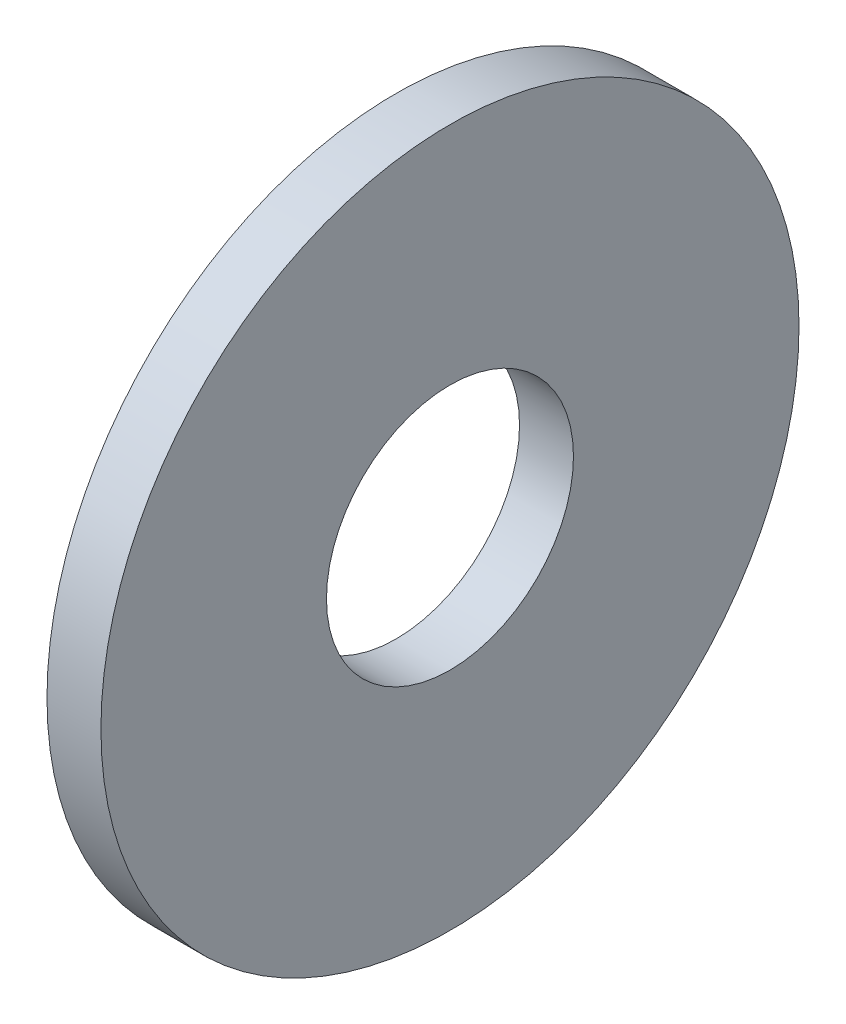
ISO-10303-21;
HEADER;
FILE_DESCRIPTION(('STEP AP214'),'2;1');
FILE_NAME('part.step','',(''),(''),'','','');
FILE_SCHEMA(('AUTOMOTIVE_DESIGN { 1 0 10303 214 1 1 1 1 }'));
ENDSEC;
DATA;
#1=APPLICATION_CONTEXT('core data for automotive mechanical design processes');
#2=APPLICATION_PROTOCOL_DEFINITION('international standard','automotive_design',2000,#1);
#3=PRODUCT_CONTEXT('',#1,'mechanical');
#4=PRODUCT('Part','Part','',(#3));
#5=PRODUCT_RELATED_PRODUCT_CATEGORY('part','',(#4));
#6=PRODUCT_DEFINITION_FORMATION('','',#4);
#7=PRODUCT_DEFINITION_CONTEXT('part definition',#1,'design');
#8=PRODUCT_DEFINITION('design','',#6,#7);
#9=PRODUCT_DEFINITION_SHAPE('','',#8);
#10=(LENGTH_UNIT() NAMED_UNIT(*) SI_UNIT(.MILLI.,.METRE.));
#11=(NAMED_UNIT(*) PLANE_ANGLE_UNIT() SI_UNIT($,.RADIAN.));
#12=(NAMED_UNIT(*) SI_UNIT($,.STERADIAN.) SOLID_ANGLE_UNIT());
#13=UNCERTAINTY_MEASURE_WITH_UNIT(LENGTH_MEASURE(1.E-05),#10,'distance_accuracy_value','');
#14=(GEOMETRIC_REPRESENTATION_CONTEXT(3) GLOBAL_UNCERTAINTY_ASSIGNED_CONTEXT((#13)) GLOBAL_UNIT_ASSIGNED_CONTEXT((#10,
#11,#12)) REPRESENTATION_CONTEXT('',''));
#15=CARTESIAN_POINT('',(0.,0.,0.));
#16=DIRECTION('',(0.,0.,1.));
#17=DIRECTION('',(1.,0.,0.));
#18=AXIS2_PLACEMENT_3D('',#15,#16,#17);
#19=CARTESIAN_POINT('',(-34.9249999999999,0.,0.));
#20=DIRECTION('',(-1.,0.,0.));
#21=DIRECTION('',(0.,0.,1.));
#22=AXIS2_PLACEMENT_3D('',#19,#20,#21);
#23=CYLINDRICAL_SURFACE('',#22,19.46);
#24=CARTESIAN_POINT('',(0.,0.,0.));
#25=DIRECTION('',(-1.,0.,0.));
#26=DIRECTION('',(0.,0.,1.));
#27=AXIS2_PLACEMENT_3D('',#24,#25,#26);
#28=CIRCLE('',#27,19.46);
#29=CARTESIAN_POINT('',(0.,0.,19.46));
#30=VERTEX_POINT('',#29);
#31=EDGE_CURVE('E10',#30,#30,#28,.T.);
#32=ORIENTED_EDGE('',*,*,#31,.F.);
#33=EDGE_LOOP('',(#32));
#34=FACE_BOUND('',#33,.T.);
#35=CARTESIAN_POINT('',(-8.5,0.,0.));
#36=DIRECTION('',(-1.,0.,0.));
#37=DIRECTION('',(0.,0.,1.));
#38=AXIS2_PLACEMENT_3D('',#35,#36,#37);
#39=CIRCLE('',#38,19.46);
#40=CARTESIAN_POINT('',(-8.5,0.,19.46));
#41=VERTEX_POINT('',#40);
#42=EDGE_CURVE('E44',#41,#41,#39,.T.);
#43=ORIENTED_EDGE('',*,*,#42,.T.);
#44=EDGE_LOOP('',(#43));
#45=FACE_BOUND('',#44,.T.);
#46=ADVANCED_FACE('F30',(#34,#45),#23,.F.);
#47=CARTESIAN_POINT('',(0.,19.46,0.));
#48=DIRECTION('',(-1.,0.,0.));
#49=DIRECTION('',(0.,0.,1.));
#50=AXIS2_PLACEMENT_3D('',#47,#48,#49);
#51=PLANE('',#50);
#52=CARTESIAN_POINT('',(0.,0.,0.));
#53=DIRECTION('',(-1.,0.,0.));
#54=DIRECTION('',(0.,0.,1.));
#55=AXIS2_PLACEMENT_3D('',#52,#53,#54);
#56=CIRCLE('',#55,55.);
#57=CARTESIAN_POINT('',(0.,0.,55.));
#58=VERTEX_POINT('',#57);
#59=EDGE_CURVE('E36',#58,#58,#56,.T.);
#60=ORIENTED_EDGE('',*,*,#59,.F.);
#61=EDGE_LOOP('',(#60));
#62=FACE_BOUND('',#61,.T.);
#63=ORIENTED_EDGE('',*,*,#31,.T.);
#64=EDGE_LOOP('',(#63));
#65=FACE_BOUND('',#64,.T.);
#66=ADVANCED_FACE('F59',(#62,#65),#51,.F.);
#67=CARTESIAN_POINT('',(-34.9249999999999,0.,0.));
#68=DIRECTION('',(-1.,0.,0.));
#69=DIRECTION('',(0.,0.,1.));
#70=AXIS2_PLACEMENT_3D('',#67,#68,#69);
#71=CYLINDRICAL_SURFACE('',#70,55.);
#72=CARTESIAN_POINT('',(-8.5,0.,0.));
#73=DIRECTION('',(-1.,0.,0.));
#74=DIRECTION('',(0.,0.,1.));
#75=AXIS2_PLACEMENT_3D('',#72,#73,#74);
#76=CIRCLE('',#75,55.);
#77=CARTESIAN_POINT('',(-8.5,0.,55.));
#78=VERTEX_POINT('',#77);
#79=EDGE_CURVE('E40',#78,#78,#76,.T.);
#80=ORIENTED_EDGE('',*,*,#79,.F.);
#81=EDGE_LOOP('',(#80));
#82=FACE_BOUND('',#81,.T.);
#83=ORIENTED_EDGE('',*,*,#59,.T.);
#84=EDGE_LOOP('',(#83));
#85=FACE_BOUND('',#84,.T.);
#86=ADVANCED_FACE('F54',(#82,#85),#71,.T.);
#87=CARTESIAN_POINT('',(-8.5,55.,0.));
#88=DIRECTION('',(1.,0.,0.));
#89=DIRECTION('',(0.,0.,-1.));
#90=AXIS2_PLACEMENT_3D('',#87,#88,#89);
#91=PLANE('',#90);
#92=ORIENTED_EDGE('',*,*,#42,.F.);
#93=EDGE_LOOP('',(#92));
#94=FACE_BOUND('',#93,.T.);
#95=ORIENTED_EDGE('',*,*,#79,.T.);
#96=EDGE_LOOP('',(#95));
#97=FACE_BOUND('',#96,.T.);
#98=ADVANCED_FACE('F51',(#94,#97),#91,.F.);
#99=CLOSED_SHELL('',(#46,#66,#86,#98));
#100=MANIFOLD_SOLID_BREP('B2',#99);
#101=ADVANCED_BREP_SHAPE_REPRESENTATION('',(#18,#100),#14);
#102=SHAPE_DEFINITION_REPRESENTATION(#9,#101);
ENDSEC;
END-ISO-10303-21;
